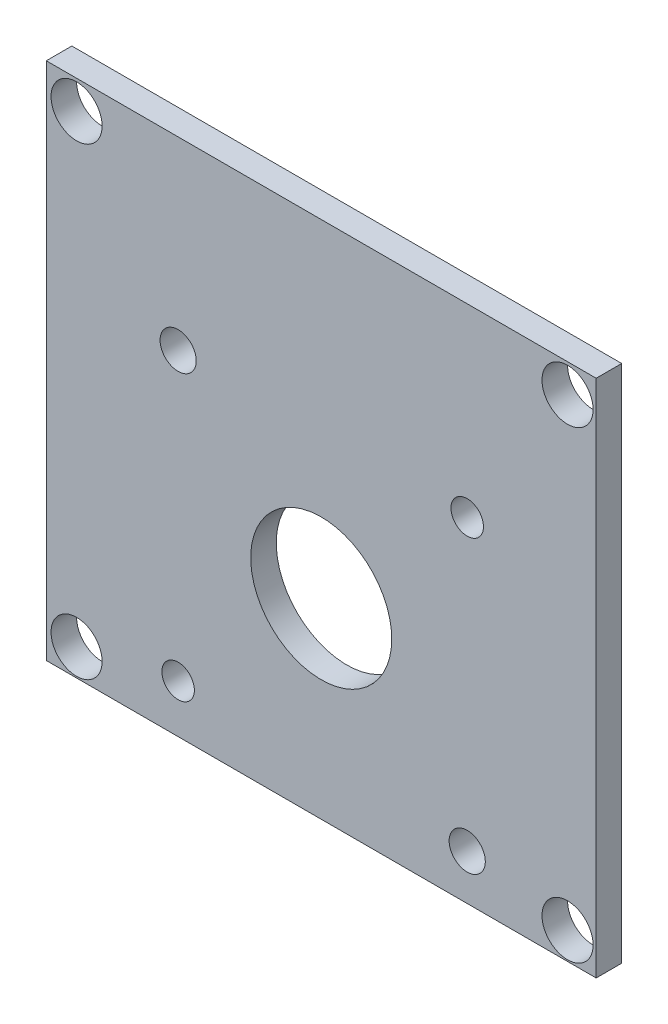
ISO-10303-21;
HEADER;
FILE_DESCRIPTION(('STEP AP214'),'2;1');
FILE_NAME('part.step','',(''),(''),'','','');
FILE_SCHEMA(('AUTOMOTIVE_DESIGN { 1 0 10303 214 1 1 1 1 }'));
ENDSEC;
DATA;
#1=APPLICATION_CONTEXT('core data for automotive mechanical design processes');
#2=APPLICATION_PROTOCOL_DEFINITION('international standard','automotive_design',2000,#1);
#3=PRODUCT_CONTEXT('',#1,'mechanical');
#4=PRODUCT('Part','Part','',(#3));
#5=PRODUCT_RELATED_PRODUCT_CATEGORY('part','',(#4));
#6=PRODUCT_DEFINITION_FORMATION('','',#4);
#7=PRODUCT_DEFINITION_CONTEXT('part definition',#1,'design');
#8=PRODUCT_DEFINITION('design','',#6,#7);
#9=PRODUCT_DEFINITION_SHAPE('','',#8);
#10=(LENGTH_UNIT() NAMED_UNIT(*) SI_UNIT(.MILLI.,.METRE.));
#11=(NAMED_UNIT(*) PLANE_ANGLE_UNIT() SI_UNIT($,.RADIAN.));
#12=(NAMED_UNIT(*) SI_UNIT($,.STERADIAN.) SOLID_ANGLE_UNIT());
#13=UNCERTAINTY_MEASURE_WITH_UNIT(LENGTH_MEASURE(1.E-05),#10,'distance_accuracy_value','');
#14=(GEOMETRIC_REPRESENTATION_CONTEXT(3) GLOBAL_UNCERTAINTY_ASSIGNED_CONTEXT((#13)) GLOBAL_UNIT_ASSIGNED_CONTEXT((#10,
#11,#12)) REPRESENTATION_CONTEXT('',''));
#15=CARTESIAN_POINT('',(0.,0.,0.));
#16=DIRECTION('',(0.,0.,1.));
#17=DIRECTION('',(1.,0.,0.));
#18=AXIS2_PLACEMENT_3D('',#15,#16,#17);
#19=CARTESIAN_POINT('',(0.,0.,3.175));
#20=DIRECTION('',(0.,0.,-1.));
#21=DIRECTION('',(-1.,0.,0.));
#22=AXIS2_PLACEMENT_3D('',#19,#20,#21);
#23=PLANE('',#22);
#24=DIRECTION('',(0.,1.,0.));
#25=VECTOR('',#24,1.);
#26=CARTESIAN_POINT('',(34.163,-32.2707,3.175));
#27=LINE('',#26,#25);
#28=CARTESIAN_POINT('',(34.163,-32.2707,3.175));
#29=VERTEX_POINT('',#28);
#30=CARTESIAN_POINT('',(34.163,32.2707,3.175));
#31=VERTEX_POINT('',#30);
#32=EDGE_CURVE('E85',#29,#31,#27,.T.);
#33=ORIENTED_EDGE('',*,*,#32,.T.);
#34=DIRECTION('',(-1.,0.,0.));
#35=VECTOR('',#34,1.);
#36=CARTESIAN_POINT('',(-34.163,32.2707,3.175));
#37=LINE('',#36,#35);
#38=CARTESIAN_POINT('',(-34.163,32.2707,3.175));
#39=VERTEX_POINT('',#38);
#40=EDGE_CURVE('E80',#31,#39,#37,.T.);
#41=ORIENTED_EDGE('',*,*,#40,.T.);
#42=DIRECTION('',(0.,-1.,0.));
#43=VECTOR('',#42,1.);
#44=CARTESIAN_POINT('',(-34.163,-32.2707,3.175));
#45=LINE('',#44,#43);
#46=CARTESIAN_POINT('',(-34.163,-32.2707,3.175));
#47=VERTEX_POINT('',#46);
#48=EDGE_CURVE('E83',#39,#47,#45,.T.);
#49=ORIENTED_EDGE('',*,*,#48,.T.);
#50=DIRECTION('',(1.,0.,0.));
#51=VECTOR('',#50,1.);
#52=CARTESIAN_POINT('',(-34.163,-32.2707,3.175));
#53=LINE('',#52,#51);
#54=EDGE_CURVE('E50',#47,#29,#53,.T.);
#55=ORIENTED_EDGE('',*,*,#54,.T.);
#56=EDGE_LOOP('',(#33,#41,#49,#55));
#57=FACE_BOUND('',#56,.T.);
#58=CARTESIAN_POINT('',(-17.78,-26.2763,3.175));
#59=DIRECTION('',(0.,0.,1.));
#60=DIRECTION('',(1.,0.,0.));
#61=AXIS2_PLACEMENT_3D('',#58,#59,#60);
#62=CIRCLE('',#61,2.0193);
#63=CARTESIAN_POINT('',(-15.7607,-26.2763,3.175));
#64=VERTEX_POINT('',#63);
#65=EDGE_CURVE('E100',#64,#64,#62,.T.);
#66=ORIENTED_EDGE('',*,*,#65,.F.);
#67=EDGE_LOOP('',(#66));
#68=FACE_BOUND('',#67,.T.);
#69=CARTESIAN_POINT('',(18.14068,9.28369999999999,3.175));
#70=DIRECTION('',(0.,0.,1.));
#71=DIRECTION('',(1.,0.,0.));
#72=AXIS2_PLACEMENT_3D('',#69,#70,#71);
#73=CIRCLE('',#72,2.01930000000001);
#74=CARTESIAN_POINT('',(20.15998,9.28369999999999,3.175));
#75=VERTEX_POINT('',#74);
#76=EDGE_CURVE('E115',#75,#75,#73,.T.);
#77=ORIENTED_EDGE('',*,*,#76,.F.);
#78=EDGE_LOOP('',(#77));
#79=FACE_BOUND('',#78,.T.);
#80=CARTESIAN_POINT('',(-17.78,9.28369999999999,3.175));
#81=DIRECTION('',(0.,0.,1.));
#82=DIRECTION('',(1.,0.,0.));
#83=AXIS2_PLACEMENT_3D('',#80,#81,#82);
#84=CIRCLE('',#83,2.2479);
#85=CARTESIAN_POINT('',(-15.5321,9.28369999999999,3.175));
#86=VERTEX_POINT('',#85);
#87=EDGE_CURVE('E121',#86,#86,#84,.T.);
#88=ORIENTED_EDGE('',*,*,#87,.F.);
#89=EDGE_LOOP('',(#88));
#90=FACE_BOUND('',#89,.T.);
#91=CARTESIAN_POINT('',(18.1410244842766,-26.6373244842766,3.175));
#92=DIRECTION('',(0.,0.,1.));
#93=DIRECTION('',(1.,0.,0.));
#94=AXIS2_PLACEMENT_3D('',#91,#92,#93);
#95=CIRCLE('',#94,2.2479);
#96=CARTESIAN_POINT('',(20.3889244842766,-26.6373244842766,3.175));
#97=VERTEX_POINT('',#96);
#98=EDGE_CURVE('E127',#97,#97,#95,.T.);
#99=ORIENTED_EDGE('',*,*,#98,.F.);
#100=EDGE_LOOP('',(#99));
#101=FACE_BOUND('',#100,.T.);
#102=CARTESIAN_POINT('',(0.,-8.49630000000001,3.175));
#103=DIRECTION('',(0.,0.,1.));
#104=DIRECTION('',(1.,0.,0.));
#105=AXIS2_PLACEMENT_3D('',#102,#103,#104);
#106=CIRCLE('',#105,8.763);
#107=CARTESIAN_POINT('',(8.763,-8.49630000000001,3.175));
#108=VERTEX_POINT('',#107);
#109=EDGE_CURVE('E133',#108,#108,#106,.T.);
#110=ORIENTED_EDGE('',*,*,#109,.F.);
#111=EDGE_LOOP('',(#110));
#112=FACE_BOUND('',#111,.T.);
#113=CARTESIAN_POINT('',(-30.3984820936639,28.7147,3.175));
#114=DIRECTION('',(0.,0.,1.));
#115=DIRECTION('',(1.,0.,0.));
#116=AXIS2_PLACEMENT_3D('',#113,#114,#115);
#117=CIRCLE('',#116,3.175);
#118=CARTESIAN_POINT('',(-27.2234820936639,28.7147,3.175));
#119=VERTEX_POINT('',#118);
#120=EDGE_CURVE('E139',#119,#119,#117,.T.);
#121=ORIENTED_EDGE('',*,*,#120,.F.);
#122=EDGE_LOOP('',(#121));
#123=FACE_BOUND('',#122,.T.);
#124=CARTESIAN_POINT('',(-30.3984820936639,-28.9116680297398,3.175));
#125=DIRECTION('',(0.,0.,1.));
#126=DIRECTION('',(1.,0.,0.));
#127=AXIS2_PLACEMENT_3D('',#124,#125,#126);
#128=CIRCLE('',#127,3.175);
#129=CARTESIAN_POINT('',(-27.2234820936639,-28.9116680297398,3.175));
#130=VERTEX_POINT('',#129);
#131=EDGE_CURVE('E145',#130,#130,#128,.T.);
#132=ORIENTED_EDGE('',*,*,#131,.F.);
#133=EDGE_LOOP('',(#132));
#134=FACE_BOUND('',#133,.T.);
#135=CARTESIAN_POINT('',(30.607,-28.9116680297398,3.175));
#136=DIRECTION('',(0.,0.,1.));
#137=DIRECTION('',(1.,0.,0.));
#138=AXIS2_PLACEMENT_3D('',#135,#136,#137);
#139=CIRCLE('',#138,3.175);
#140=CARTESIAN_POINT('',(33.782,-28.9116680297398,3.175));
#141=VERTEX_POINT('',#140);
#142=EDGE_CURVE('E151',#141,#141,#139,.T.);
#143=ORIENTED_EDGE('',*,*,#142,.F.);
#144=EDGE_LOOP('',(#143));
#145=FACE_BOUND('',#144,.T.);
#146=CARTESIAN_POINT('',(30.607,28.7147,3.175));
#147=DIRECTION('',(0.,0.,1.));
#148=DIRECTION('',(1.,0.,0.));
#149=AXIS2_PLACEMENT_3D('',#146,#147,#148);
#150=CIRCLE('',#149,3.175);
#151=CARTESIAN_POINT('',(33.782,28.7147,3.175));
#152=VERTEX_POINT('',#151);
#153=EDGE_CURVE('E157',#152,#152,#150,.T.);
#154=ORIENTED_EDGE('',*,*,#153,.F.);
#155=EDGE_LOOP('',(#154));
#156=FACE_BOUND('',#155,.T.);
#157=ADVANCED_FACE('F33',(#57,#68,#79,#90,#101,#112,#123,#134,#145,#156),#23,.F.);
#158=CARTESIAN_POINT('',(0.,0.,0.));
#159=DIRECTION('',(0.,0.,-1.));
#160=DIRECTION('',(-1.,0.,0.));
#161=AXIS2_PLACEMENT_3D('',#158,#159,#160);
#162=PLANE('',#161);
#163=CARTESIAN_POINT('',(30.607,-28.9116680297398,0.));
#164=DIRECTION('',(0.,0.,1.));
#165=DIRECTION('',(1.,0.,0.));
#166=AXIS2_PLACEMENT_3D('',#163,#164,#165);
#167=CIRCLE('',#166,3.175);
#168=CARTESIAN_POINT('',(33.782,-28.9116680297398,0.));
#169=VERTEX_POINT('',#168);
#170=EDGE_CURVE('E154',#169,#169,#167,.T.);
#171=ORIENTED_EDGE('',*,*,#170,.T.);
#172=EDGE_LOOP('',(#171));
#173=FACE_BOUND('',#172,.T.);
#174=CARTESIAN_POINT('',(-30.3984820936639,28.7147,0.));
#175=DIRECTION('',(0.,0.,1.));
#176=DIRECTION('',(1.,0.,0.));
#177=AXIS2_PLACEMENT_3D('',#174,#175,#176);
#178=CIRCLE('',#177,3.175);
#179=CARTESIAN_POINT('',(-27.2234820936639,28.7147,0.));
#180=VERTEX_POINT('',#179);
#181=EDGE_CURVE('E142',#180,#180,#178,.T.);
#182=ORIENTED_EDGE('',*,*,#181,.T.);
#183=EDGE_LOOP('',(#182));
#184=FACE_BOUND('',#183,.T.);
#185=CARTESIAN_POINT('',(18.1410244842766,-26.6373244842766,0.));
#186=DIRECTION('',(0.,0.,1.));
#187=DIRECTION('',(1.,0.,0.));
#188=AXIS2_PLACEMENT_3D('',#185,#186,#187);
#189=CIRCLE('',#188,2.2479);
#190=CARTESIAN_POINT('',(20.3889244842766,-26.6373244842766,0.));
#191=VERTEX_POINT('',#190);
#192=EDGE_CURVE('E130',#191,#191,#189,.T.);
#193=ORIENTED_EDGE('',*,*,#192,.T.);
#194=EDGE_LOOP('',(#193));
#195=FACE_BOUND('',#194,.T.);
#196=CARTESIAN_POINT('',(18.14068,9.28369999999999,0.));
#197=DIRECTION('',(0.,0.,1.));
#198=DIRECTION('',(1.,0.,0.));
#199=AXIS2_PLACEMENT_3D('',#196,#197,#198);
#200=CIRCLE('',#199,2.01930000000001);
#201=CARTESIAN_POINT('',(20.15998,9.28369999999999,0.));
#202=VERTEX_POINT('',#201);
#203=EDGE_CURVE('E118',#202,#202,#200,.T.);
#204=ORIENTED_EDGE('',*,*,#203,.T.);
#205=EDGE_LOOP('',(#204));
#206=FACE_BOUND('',#205,.T.);
#207=DIRECTION('',(0.,1.,0.));
#208=VECTOR('',#207,1.);
#209=CARTESIAN_POINT('',(34.163,-32.2707,0.));
#210=LINE('',#209,#208);
#211=CARTESIAN_POINT('',(34.163,-32.2707,0.));
#212=VERTEX_POINT('',#211);
#213=CARTESIAN_POINT('',(34.163,32.2707,0.));
#214=VERTEX_POINT('',#213);
#215=EDGE_CURVE('E97',#212,#214,#210,.T.);
#216=ORIENTED_EDGE('',*,*,#215,.F.);
#217=DIRECTION('',(1.,0.,0.));
#218=VECTOR('',#217,1.);
#219=CARTESIAN_POINT('',(-34.163,-32.2707,0.));
#220=LINE('',#219,#218);
#221=CARTESIAN_POINT('',(-34.163,-32.2707,0.));
#222=VERTEX_POINT('',#221);
#223=EDGE_CURVE('E73',#222,#212,#220,.T.);
#224=ORIENTED_EDGE('',*,*,#223,.F.);
#225=DIRECTION('',(0.,-1.,0.));
#226=VECTOR('',#225,1.);
#227=CARTESIAN_POINT('',(-34.163,-32.2707,0.));
#228=LINE('',#227,#226);
#229=CARTESIAN_POINT('',(-34.163,32.2707,0.));
#230=VERTEX_POINT('',#229);
#231=EDGE_CURVE('E67',#230,#222,#228,.T.);
#232=ORIENTED_EDGE('',*,*,#231,.F.);
#233=DIRECTION('',(-1.,0.,0.));
#234=VECTOR('',#233,1.);
#235=CARTESIAN_POINT('',(-34.163,32.2707,0.));
#236=LINE('',#235,#234);
#237=EDGE_CURVE('E89',#214,#230,#236,.T.);
#238=ORIENTED_EDGE('',*,*,#237,.F.);
#239=EDGE_LOOP('',(#216,#224,#232,#238));
#240=FACE_BOUND('',#239,.T.);
#241=CARTESIAN_POINT('',(-17.78,-26.2763,0.));
#242=DIRECTION('',(0.,0.,1.));
#243=DIRECTION('',(1.,0.,0.));
#244=AXIS2_PLACEMENT_3D('',#241,#242,#243);
#245=CIRCLE('',#244,2.0193);
#246=CARTESIAN_POINT('',(-15.7607,-26.2763,0.));
#247=VERTEX_POINT('',#246);
#248=EDGE_CURVE('E112',#247,#247,#245,.T.);
#249=ORIENTED_EDGE('',*,*,#248,.T.);
#250=EDGE_LOOP('',(#249));
#251=FACE_BOUND('',#250,.T.);
#252=CARTESIAN_POINT('',(-17.78,9.28369999999999,0.));
#253=DIRECTION('',(0.,0.,1.));
#254=DIRECTION('',(1.,0.,0.));
#255=AXIS2_PLACEMENT_3D('',#252,#253,#254);
#256=CIRCLE('',#255,2.2479);
#257=CARTESIAN_POINT('',(-15.5321,9.28369999999999,0.));
#258=VERTEX_POINT('',#257);
#259=EDGE_CURVE('E124',#258,#258,#256,.T.);
#260=ORIENTED_EDGE('',*,*,#259,.T.);
#261=EDGE_LOOP('',(#260));
#262=FACE_BOUND('',#261,.T.);
#263=CARTESIAN_POINT('',(0.,-8.49630000000001,0.));
#264=DIRECTION('',(0.,0.,1.));
#265=DIRECTION('',(1.,0.,0.));
#266=AXIS2_PLACEMENT_3D('',#263,#264,#265);
#267=CIRCLE('',#266,8.763);
#268=CARTESIAN_POINT('',(8.763,-8.49630000000001,0.));
#269=VERTEX_POINT('',#268);
#270=EDGE_CURVE('E136',#269,#269,#267,.T.);
#271=ORIENTED_EDGE('',*,*,#270,.T.);
#272=EDGE_LOOP('',(#271));
#273=FACE_BOUND('',#272,.T.);
#274=CARTESIAN_POINT('',(-30.3984820936639,-28.9116680297398,0.));
#275=DIRECTION('',(0.,0.,1.));
#276=DIRECTION('',(1.,0.,0.));
#277=AXIS2_PLACEMENT_3D('',#274,#275,#276);
#278=CIRCLE('',#277,3.175);
#279=CARTESIAN_POINT('',(-27.2234820936639,-28.9116680297398,0.));
#280=VERTEX_POINT('',#279);
#281=EDGE_CURVE('E148',#280,#280,#278,.T.);
#282=ORIENTED_EDGE('',*,*,#281,.T.);
#283=EDGE_LOOP('',(#282));
#284=FACE_BOUND('',#283,.T.);
#285=CARTESIAN_POINT('',(30.607,28.7147,0.));
#286=DIRECTION('',(0.,0.,1.));
#287=DIRECTION('',(1.,0.,0.));
#288=AXIS2_PLACEMENT_3D('',#285,#286,#287);
#289=CIRCLE('',#288,3.175);
#290=CARTESIAN_POINT('',(33.782,28.7147,0.));
#291=VERTEX_POINT('',#290);
#292=EDGE_CURVE('E160',#291,#291,#289,.T.);
#293=ORIENTED_EDGE('',*,*,#292,.T.);
#294=EDGE_LOOP('',(#293));
#295=FACE_BOUND('',#294,.T.);
#296=ADVANCED_FACE('F108',(#173,#184,#195,#206,#240,#251,#262,#273,#284,#295),#162,.T.);
#297=CARTESIAN_POINT('',(34.163,-32.2707,3.175));
#298=DIRECTION('',(-1.,0.,0.));
#299=DIRECTION('',(0.,0.,1.));
#300=AXIS2_PLACEMENT_3D('',#297,#298,#299);
#301=PLANE('',#300);
#302=ORIENTED_EDGE('',*,*,#215,.T.);
#303=DIRECTION('',(0.,0.,-1.));
#304=VECTOR('',#303,1.);
#305=CARTESIAN_POINT('',(34.163,32.2707,3.175));
#306=LINE('',#305,#304);
#307=EDGE_CURVE('E11',#31,#214,#306,.T.);
#308=ORIENTED_EDGE('',*,*,#307,.F.);
#309=ORIENTED_EDGE('',*,*,#32,.F.);
#310=DIRECTION('',(0.,0.,-1.));
#311=VECTOR('',#310,1.);
#312=CARTESIAN_POINT('',(34.163,-32.2707,3.175));
#313=LINE('',#312,#311);
#314=EDGE_CURVE('E93',#29,#212,#313,.T.);
#315=ORIENTED_EDGE('',*,*,#314,.T.);
#316=EDGE_LOOP('',(#302,#308,#309,#315));
#317=FACE_BOUND('',#316,.T.);
#318=ADVANCED_FACE('F35',(#317),#301,.F.);
#319=CARTESIAN_POINT('',(-34.163,32.2707,3.175));
#320=DIRECTION('',(0.,-1.,0.));
#321=DIRECTION('',(0.,0.,-1.));
#322=AXIS2_PLACEMENT_3D('',#319,#320,#321);
#323=PLANE('',#322);
#324=ORIENTED_EDGE('',*,*,#237,.T.);
#325=DIRECTION('',(0.,0.,-1.));
#326=VECTOR('',#325,1.);
#327=CARTESIAN_POINT('',(-34.163,32.2707,3.175));
#328=LINE('',#327,#326);
#329=EDGE_CURVE('E42',#39,#230,#328,.T.);
#330=ORIENTED_EDGE('',*,*,#329,.F.);
#331=ORIENTED_EDGE('',*,*,#40,.F.);
#332=ORIENTED_EDGE('',*,*,#307,.T.);
#333=EDGE_LOOP('',(#324,#330,#331,#332));
#334=FACE_BOUND('',#333,.T.);
#335=ADVANCED_FACE('F88',(#334),#323,.F.);
#336=CARTESIAN_POINT('',(-34.163,-32.2707,3.175));
#337=DIRECTION('',(1.,0.,0.));
#338=DIRECTION('',(0.,0.,-1.));
#339=AXIS2_PLACEMENT_3D('',#336,#337,#338);
#340=PLANE('',#339);
#341=ORIENTED_EDGE('',*,*,#231,.T.);
#342=DIRECTION('',(0.,0.,-1.));
#343=VECTOR('',#342,1.);
#344=CARTESIAN_POINT('',(-34.163,-32.2707,3.175));
#345=LINE('',#344,#343);
#346=EDGE_CURVE('E90',#47,#222,#345,.T.);
#347=ORIENTED_EDGE('',*,*,#346,.F.);
#348=ORIENTED_EDGE('',*,*,#48,.F.);
#349=ORIENTED_EDGE('',*,*,#329,.T.);
#350=EDGE_LOOP('',(#341,#347,#348,#349));
#351=FACE_BOUND('',#350,.T.);
#352=ADVANCED_FACE('F91',(#351),#340,.F.);
#353=CARTESIAN_POINT('',(-34.163,-32.2707,3.175));
#354=DIRECTION('',(0.,1.,0.));
#355=DIRECTION('',(0.,0.,1.));
#356=AXIS2_PLACEMENT_3D('',#353,#354,#355);
#357=PLANE('',#356);
#358=ORIENTED_EDGE('',*,*,#223,.T.);
#359=ORIENTED_EDGE('',*,*,#314,.F.);
#360=ORIENTED_EDGE('',*,*,#54,.F.);
#361=ORIENTED_EDGE('',*,*,#346,.T.);
#362=EDGE_LOOP('',(#358,#359,#360,#361));
#363=FACE_BOUND('',#362,.T.);
#364=ADVANCED_FACE('F105',(#363),#357,.F.);
#365=CARTESIAN_POINT('',(-17.78,-26.2763,3.175));
#366=DIRECTION('',(0.,0.,-1.));
#367=DIRECTION('',(-1.,0.,0.));
#368=AXIS2_PLACEMENT_3D('',#365,#366,#367);
#369=CYLINDRICAL_SURFACE('',#368,2.0193);
#370=ORIENTED_EDGE('',*,*,#65,.T.);
#371=EDGE_LOOP('',(#370));
#372=FACE_BOUND('',#371,.T.);
#373=ORIENTED_EDGE('',*,*,#248,.F.);
#374=EDGE_LOOP('',(#373));
#375=FACE_BOUND('',#374,.T.);
#376=ADVANCED_FACE('F177',(#372,#375),#369,.F.);
#377=CARTESIAN_POINT('',(18.14068,9.28369999999999,3.175));
#378=DIRECTION('',(0.,0.,-1.));
#379=DIRECTION('',(-1.,0.,0.));
#380=AXIS2_PLACEMENT_3D('',#377,#378,#379);
#381=CYLINDRICAL_SURFACE('',#380,2.01930000000001);
#382=ORIENTED_EDGE('',*,*,#76,.T.);
#383=EDGE_LOOP('',(#382));
#384=FACE_BOUND('',#383,.T.);
#385=ORIENTED_EDGE('',*,*,#203,.F.);
#386=EDGE_LOOP('',(#385));
#387=FACE_BOUND('',#386,.T.);
#388=ADVANCED_FACE('F223',(#384,#387),#381,.F.);
#389=CARTESIAN_POINT('',(-17.78,9.28369999999999,3.175));
#390=DIRECTION('',(0.,0.,-1.));
#391=DIRECTION('',(-1.,0.,0.));
#392=AXIS2_PLACEMENT_3D('',#389,#390,#391);
#393=CYLINDRICAL_SURFACE('',#392,2.2479);
#394=ORIENTED_EDGE('',*,*,#87,.T.);
#395=EDGE_LOOP('',(#394));
#396=FACE_BOUND('',#395,.T.);
#397=ORIENTED_EDGE('',*,*,#259,.F.);
#398=EDGE_LOOP('',(#397));
#399=FACE_BOUND('',#398,.T.);
#400=ADVANCED_FACE('F231',(#396,#399),#393,.F.);
#401=CARTESIAN_POINT('',(18.1410244842766,-26.6373244842766,3.175));
#402=DIRECTION('',(0.,0.,-1.));
#403=DIRECTION('',(-1.,0.,0.));
#404=AXIS2_PLACEMENT_3D('',#401,#402,#403);
#405=CYLINDRICAL_SURFACE('',#404,2.2479);
#406=ORIENTED_EDGE('',*,*,#98,.T.);
#407=EDGE_LOOP('',(#406));
#408=FACE_BOUND('',#407,.T.);
#409=ORIENTED_EDGE('',*,*,#192,.F.);
#410=EDGE_LOOP('',(#409));
#411=FACE_BOUND('',#410,.T.);
#412=ADVANCED_FACE('F239',(#408,#411),#405,.F.);
#413=CARTESIAN_POINT('',(0.,-8.49630000000001,3.175));
#414=DIRECTION('',(0.,0.,-1.));
#415=DIRECTION('',(-1.,0.,0.));
#416=AXIS2_PLACEMENT_3D('',#413,#414,#415);
#417=CYLINDRICAL_SURFACE('',#416,8.763);
#418=ORIENTED_EDGE('',*,*,#109,.T.);
#419=EDGE_LOOP('',(#418));
#420=FACE_BOUND('',#419,.T.);
#421=ORIENTED_EDGE('',*,*,#270,.F.);
#422=EDGE_LOOP('',(#421));
#423=FACE_BOUND('',#422,.T.);
#424=ADVANCED_FACE('F248',(#420,#423),#417,.F.);
#425=CARTESIAN_POINT('',(-30.3984820936639,28.7147,3.175));
#426=DIRECTION('',(0.,0.,-1.));
#427=DIRECTION('',(-1.,0.,0.));
#428=AXIS2_PLACEMENT_3D('',#425,#426,#427);
#429=CYLINDRICAL_SURFACE('',#428,3.175);
#430=ORIENTED_EDGE('',*,*,#120,.T.);
#431=EDGE_LOOP('',(#430));
#432=FACE_BOUND('',#431,.T.);
#433=ORIENTED_EDGE('',*,*,#181,.F.);
#434=EDGE_LOOP('',(#433));
#435=FACE_BOUND('',#434,.T.);
#436=ADVANCED_FACE('F257',(#432,#435),#429,.F.);
#437=CARTESIAN_POINT('',(-30.3984820936639,-28.9116680297398,3.175));
#438=DIRECTION('',(0.,0.,-1.));
#439=DIRECTION('',(-1.,0.,0.));
#440=AXIS2_PLACEMENT_3D('',#437,#438,#439);
#441=CYLINDRICAL_SURFACE('',#440,3.175);
#442=ORIENTED_EDGE('',*,*,#131,.T.);
#443=EDGE_LOOP('',(#442));
#444=FACE_BOUND('',#443,.T.);
#445=ORIENTED_EDGE('',*,*,#281,.F.);
#446=EDGE_LOOP('',(#445));
#447=FACE_BOUND('',#446,.T.);
#448=ADVANCED_FACE('F266',(#444,#447),#441,.F.);
#449=CARTESIAN_POINT('',(30.607,-28.9116680297398,3.175));
#450=DIRECTION('',(0.,0.,-1.));
#451=DIRECTION('',(-1.,0.,0.));
#452=AXIS2_PLACEMENT_3D('',#449,#450,#451);
#453=CYLINDRICAL_SURFACE('',#452,3.175);
#454=ORIENTED_EDGE('',*,*,#142,.T.);
#455=EDGE_LOOP('',(#454));
#456=FACE_BOUND('',#455,.T.);
#457=ORIENTED_EDGE('',*,*,#170,.F.);
#458=EDGE_LOOP('',(#457));
#459=FACE_BOUND('',#458,.T.);
#460=ADVANCED_FACE('F275',(#456,#459),#453,.F.);
#461=CARTESIAN_POINT('',(30.607,28.7147,3.175));
#462=DIRECTION('',(0.,0.,-1.));
#463=DIRECTION('',(-1.,0.,0.));
#464=AXIS2_PLACEMENT_3D('',#461,#462,#463);
#465=CYLINDRICAL_SURFACE('',#464,3.175);
#466=ORIENTED_EDGE('',*,*,#153,.T.);
#467=EDGE_LOOP('',(#466));
#468=FACE_BOUND('',#467,.T.);
#469=ORIENTED_EDGE('',*,*,#292,.F.);
#470=EDGE_LOOP('',(#469));
#471=FACE_BOUND('',#470,.T.);
#472=ADVANCED_FACE('F166',(#468,#471),#465,.F.);
#473=CLOSED_SHELL('',(#157,#296,#318,#335,#352,#364,#376,#388,#400,#412,#424,#436,#448,#460,#472));
#474=MANIFOLD_SOLID_BREP('B2',#473);
#475=ADVANCED_BREP_SHAPE_REPRESENTATION('',(#18,#474),#14);
#476=SHAPE_DEFINITION_REPRESENTATION(#9,#475);
ENDSEC;
END-ISO-10303-21;
